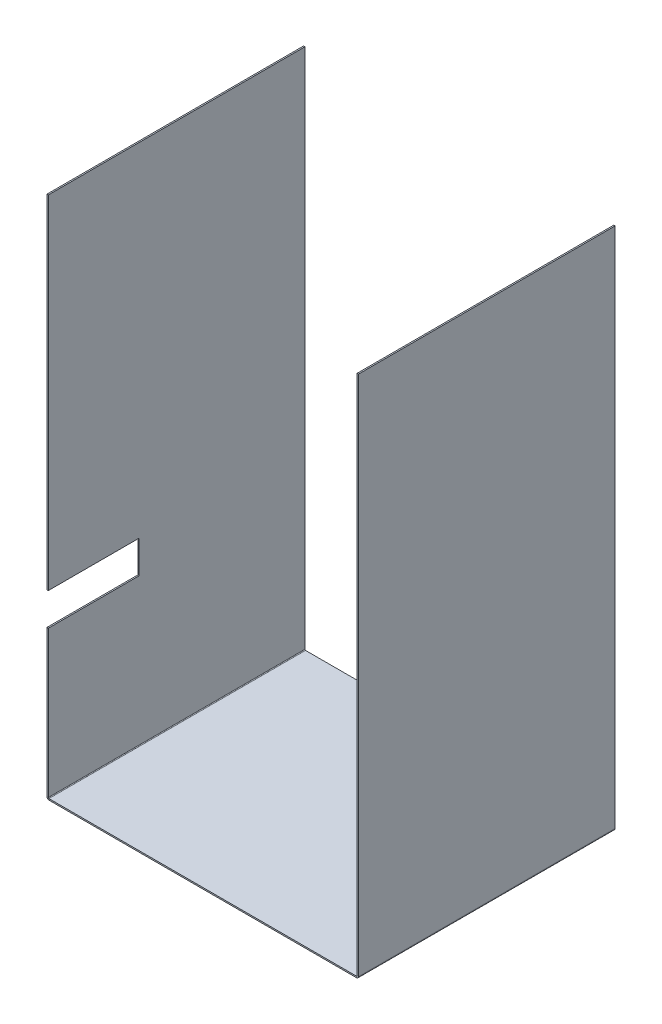
ISO-10303-21;
HEADER;
FILE_DESCRIPTION(('STEP AP214'),'2;1');
FILE_NAME('part.step','',(''),(''),'','','');
FILE_SCHEMA(('AUTOMOTIVE_DESIGN { 1 0 10303 214 1 1 1 1 }'));
ENDSEC;
DATA;
#1=APPLICATION_CONTEXT('core data for automotive mechanical design processes');
#2=APPLICATION_PROTOCOL_DEFINITION('international standard','automotive_design',2000,#1);
#3=PRODUCT_CONTEXT('',#1,'mechanical');
#4=PRODUCT('Part','Part','',(#3));
#5=PRODUCT_RELATED_PRODUCT_CATEGORY('part','',(#4));
#6=PRODUCT_DEFINITION_FORMATION('','',#4);
#7=PRODUCT_DEFINITION_CONTEXT('part definition',#1,'design');
#8=PRODUCT_DEFINITION('design','',#6,#7);
#9=PRODUCT_DEFINITION_SHAPE('','',#8);
#10=(LENGTH_UNIT() NAMED_UNIT(*) SI_UNIT(.MILLI.,.METRE.));
#11=(NAMED_UNIT(*) PLANE_ANGLE_UNIT() SI_UNIT($,.RADIAN.));
#12=(NAMED_UNIT(*) SI_UNIT($,.STERADIAN.) SOLID_ANGLE_UNIT());
#13=UNCERTAINTY_MEASURE_WITH_UNIT(LENGTH_MEASURE(1.E-05),#10,'distance_accuracy_value','');
#14=(GEOMETRIC_REPRESENTATION_CONTEXT(3) GLOBAL_UNCERTAINTY_ASSIGNED_CONTEXT((#13)) GLOBAL_UNIT_ASSIGNED_CONTEXT((#10,
#11,#12)) REPRESENTATION_CONTEXT('',''));
#15=CARTESIAN_POINT('',(0.,0.,0.));
#16=DIRECTION('',(0.,0.,1.));
#17=DIRECTION('',(1.,0.,0.));
#18=AXIS2_PLACEMENT_3D('',#15,#16,#17);
#19=CARTESIAN_POINT('',(112.814408783464,-313.416268033811,280.));
#20=DIRECTION('',(0.,0.,1.));
#21=DIRECTION('',(-1.,0.,0.));
#22=AXIS2_PLACEMENT_3D('',#19,#20,#21);
#23=PLANE('',#22);
#24=DIRECTION('',(-1.,0.,0.));
#25=VECTOR('',#24,1.);
#26=CARTESIAN_POINT('',(112.814408783464,-118.015892073635,280.));
#27=LINE('',#26,#25);
#28=CARTESIAN_POINT('',(-223.448991216536,-118.015892073635,280.));
#29=VERTEX_POINT('',#28);
#30=CARTESIAN_POINT('',(-224.948991216536,-118.015892073635,280.));
#31=VERTEX_POINT('',#30);
#32=EDGE_CURVE('E11',#29,#31,#27,.T.);
#33=ORIENTED_EDGE('',*,*,#32,.F.);
#34=DIRECTION('',(0.,-1.,0.));
#35=VECTOR('',#34,1.);
#36=CARTESIAN_POINT('',(-223.448991216536,255.847131966189,280.));
#37=LINE('',#36,#35);
#38=CARTESIAN_POINT('',(-223.448991216536,255.847131966189,280.));
#39=VERTEX_POINT('',#38);
#40=EDGE_CURVE('E281',#39,#29,#37,.T.);
#41=ORIENTED_EDGE('',*,*,#40,.F.);
#42=DIRECTION('',(1.,0.,0.));
#43=VECTOR('',#42,1.);
#44=CARTESIAN_POINT('',(-224.948991216536,255.847131966189,280.));
#45=LINE('',#44,#43);
#46=CARTESIAN_POINT('',(-224.948991216536,255.847131966189,280.));
#47=VERTEX_POINT('',#46);
#48=EDGE_CURVE('E285',#47,#39,#45,.T.);
#49=ORIENTED_EDGE('',*,*,#48,.F.);
#50=DIRECTION('',(0.,-1.,0.));
#51=VECTOR('',#50,1.);
#52=CARTESIAN_POINT('',(-224.948991216536,255.847131966189,280.));
#53=LINE('',#52,#51);
#54=EDGE_CURVE('E168',#47,#31,#53,.T.);
#55=ORIENTED_EDGE('',*,*,#54,.T.);
#56=EDGE_LOOP('',(#33,#41,#49,#55));
#57=FACE_BOUND('',#56,.T.);
#58=ADVANCED_FACE('F38',(#57),#23,.T.);
#59=CARTESIAN_POINT('',(113.551008783464,-313.416268033811,280.));
#60=DIRECTION('',(0.,0.,1.));
#61=DIRECTION('',(1.,0.,0.));
#62=AXIS2_PLACEMENT_3D('',#59,#60,#61);
#63=PLANE('',#62);
#64=DIRECTION('',(1.,0.,0.));
#65=VECTOR('',#64,1.);
#66=CARTESIAN_POINT('',(113.551008783464,-313.416268033811,280.));
#67=LINE('',#66,#65);
#68=CARTESIAN_POINT('',(113.551008783464,-313.416268033811,280.));
#69=VERTEX_POINT('',#68);
#70=CARTESIAN_POINT('',(115.051008783464,-313.416268033811,280.));
#71=VERTEX_POINT('',#70);
#72=EDGE_CURVE('E63',#69,#71,#67,.T.);
#73=ORIENTED_EDGE('',*,*,#72,.F.);
#74=CARTESIAN_POINT('',(112.814408783464,-313.416268033811,280.));
#75=DIRECTION('',(0.,0.,1.));
#76=DIRECTION('',(1.,0.,0.));
#77=AXIS2_PLACEMENT_3D('',#74,#75,#76);
#78=CIRCLE('',#77,0.7366);
#79=CARTESIAN_POINT('',(112.814408783464,-314.152868033811,280.));
#80=VERTEX_POINT('',#79);
#81=EDGE_CURVE('E325',#80,#69,#78,.T.);
#82=ORIENTED_EDGE('',*,*,#81,.F.);
#83=DIRECTION('',(0.,1.,0.));
#84=VECTOR('',#83,1.);
#85=CARTESIAN_POINT('',(112.814408783464,-315.652868033811,280.));
#86=LINE('',#85,#84);
#87=CARTESIAN_POINT('',(112.814408783464,-315.652868033811,280.));
#88=VERTEX_POINT('',#87);
#89=EDGE_CURVE('E255',#88,#80,#86,.T.);
#90=ORIENTED_EDGE('',*,*,#89,.F.);
#91=CARTESIAN_POINT('',(112.814408783464,-313.416268033811,280.));
#92=DIRECTION('',(0.,0.,1.));
#93=DIRECTION('',(-1.,0.,0.));
#94=AXIS2_PLACEMENT_3D('',#91,#92,#93);
#95=CIRCLE('',#94,2.2366);
#96=EDGE_CURVE('E185',#88,#71,#95,.T.);
#97=ORIENTED_EDGE('',*,*,#96,.T.);
#98=EDGE_LOOP('',(#73,#82,#90,#97));
#99=FACE_BOUND('',#98,.T.);
#100=ADVANCED_FACE('F40',(#99),#63,.T.);
#101=CARTESIAN_POINT('',(112.814408783464,-315.652868033811,280.));
#102=DIRECTION('',(0.,0.,1.));
#103=DIRECTION('',(1.,0.,0.));
#104=AXIS2_PLACEMENT_3D('',#101,#102,#103);
#105=PLANE('',#104);
#106=DIRECTION('',(0.,1.,0.));
#107=VECTOR('',#106,1.);
#108=CARTESIAN_POINT('',(113.551008783464,-314.152868033811,280.));
#109=LINE('',#108,#107);
#110=CARTESIAN_POINT('',(113.551008783464,255.847131966189,280.));
#111=VERTEX_POINT('',#110);
#112=EDGE_CURVE('E326',#69,#111,#109,.T.);
#113=ORIENTED_EDGE('',*,*,#112,.F.);
#114=ORIENTED_EDGE('',*,*,#72,.T.);
#115=DIRECTION('',(0.,1.,0.));
#116=VECTOR('',#115,1.);
#117=CARTESIAN_POINT('',(115.051008783464,-314.152868033811,280.));
#118=LINE('',#117,#116);
#119=CARTESIAN_POINT('',(115.051008783464,255.847131966189,280.));
#120=VERTEX_POINT('',#119);
#121=EDGE_CURVE('E115',#71,#120,#118,.T.);
#122=ORIENTED_EDGE('',*,*,#121,.T.);
#123=DIRECTION('',(1.,0.,0.));
#124=VECTOR('',#123,1.);
#125=CARTESIAN_POINT('',(113.551008783464,255.847131966189,280.));
#126=LINE('',#125,#124);
#127=EDGE_CURVE('E329',#111,#120,#126,.T.);
#128=ORIENTED_EDGE('',*,*,#127,.F.);
#129=EDGE_LOOP('',(#113,#114,#122,#128));
#130=FACE_BOUND('',#129,.T.);
#131=ADVANCED_FACE('F371',(#130),#105,.T.);
#132=CARTESIAN_POINT('',(112.814408783464,-314.152868033811,0.));
#133=DIRECTION('',(0.,0.,-1.));
#134=DIRECTION('',(-1.,0.,0.));
#135=AXIS2_PLACEMENT_3D('',#132,#133,#134);
#136=PLANE('',#135);
#137=DIRECTION('',(0.,-1.,0.));
#138=VECTOR('',#137,1.);
#139=CARTESIAN_POINT('',(112.814408783464,-314.152868033811,0.));
#140=LINE('',#139,#138);
#141=CARTESIAN_POINT('',(112.814408783464,-314.152868033811,0.));
#142=VERTEX_POINT('',#141);
#143=CARTESIAN_POINT('',(112.814408783464,-315.652868033811,0.));
#144=VERTEX_POINT('',#143);
#145=EDGE_CURVE('E253',#142,#144,#140,.T.);
#146=ORIENTED_EDGE('',*,*,#145,.F.);
#147=CARTESIAN_POINT('',(112.814408783464,-313.416268033811,0.));
#148=DIRECTION('',(0.,0.,1.));
#149=DIRECTION('',(1.,0.,0.));
#150=AXIS2_PLACEMENT_3D('',#147,#148,#149);
#151=CIRCLE('',#150,0.7366);
#152=CARTESIAN_POINT('',(113.551008783464,-313.416268033811,0.));
#153=VERTEX_POINT('',#152);
#154=EDGE_CURVE('E201',#142,#153,#151,.T.);
#155=ORIENTED_EDGE('',*,*,#154,.T.);
#156=DIRECTION('',(-1.,0.,0.));
#157=VECTOR('',#156,1.);
#158=CARTESIAN_POINT('',(115.051008783464,-313.416268033811,0.));
#159=LINE('',#158,#157);
#160=CARTESIAN_POINT('',(115.051008783464,-313.416268033811,0.));
#161=VERTEX_POINT('',#160);
#162=EDGE_CURVE('E109',#161,#153,#159,.T.);
#163=ORIENTED_EDGE('',*,*,#162,.F.);
#164=CARTESIAN_POINT('',(112.814408783464,-313.416268033811,0.));
#165=DIRECTION('',(0.,0.,1.));
#166=DIRECTION('',(-1.,0.,0.));
#167=AXIS2_PLACEMENT_3D('',#164,#165,#166);
#168=CIRCLE('',#167,2.2366);
#169=EDGE_CURVE('E221',#144,#161,#168,.T.);
#170=ORIENTED_EDGE('',*,*,#169,.F.);
#171=EDGE_LOOP('',(#146,#155,#163,#170));
#172=FACE_BOUND('',#171,.T.);
#173=ADVANCED_FACE('F320',(#172),#136,.T.);
#174=CARTESIAN_POINT('',(115.051008783464,-313.416268033811,0.));
#175=DIRECTION('',(0.,0.,-1.));
#176=DIRECTION('',(-1.,0.,0.));
#177=AXIS2_PLACEMENT_3D('',#174,#175,#176);
#178=PLANE('',#177);
#179=DIRECTION('',(1.,0.,0.));
#180=VECTOR('',#179,1.);
#181=CARTESIAN_POINT('',(-223.448991216536,-314.152868033811,0.));
#182=LINE('',#181,#180);
#183=CARTESIAN_POINT('',(-222.712391216536,-314.152868033811,0.));
#184=VERTEX_POINT('',#183);
#185=EDGE_CURVE('E203',#184,#142,#182,.T.);
#186=ORIENTED_EDGE('',*,*,#185,.T.);
#187=ORIENTED_EDGE('',*,*,#145,.T.);
#188=DIRECTION('',(1.,0.,0.));
#189=VECTOR('',#188,1.);
#190=CARTESIAN_POINT('',(-223.448991216536,-315.652868033811,0.));
#191=LINE('',#190,#189);
#192=CARTESIAN_POINT('',(-222.712391216536,-315.652868033811,0.));
#193=VERTEX_POINT('',#192);
#194=EDGE_CURVE('E219',#193,#144,#191,.T.);
#195=ORIENTED_EDGE('',*,*,#194,.F.);
#196=DIRECTION('',(0.,1.,0.));
#197=VECTOR('',#196,1.);
#198=CARTESIAN_POINT('',(-222.712391216536,-315.652868033811,0.));
#199=LINE('',#198,#197);
#200=EDGE_CURVE('E247',#193,#184,#199,.T.);
#201=ORIENTED_EDGE('',*,*,#200,.T.);
#202=EDGE_LOOP('',(#186,#187,#195,#201));
#203=FACE_BOUND('',#202,.T.);
#204=ADVANCED_FACE('F306',(#203),#178,.T.);
#205=CARTESIAN_POINT('',(-222.712391216536,-314.152868033811,280.));
#206=DIRECTION('',(0.,0.,1.));
#207=DIRECTION('',(1.,0.,0.));
#208=AXIS2_PLACEMENT_3D('',#205,#206,#207);
#209=PLANE('',#208);
#210=DIRECTION('',(0.,-1.,0.));
#211=VECTOR('',#210,1.);
#212=CARTESIAN_POINT('',(-222.712391216536,-314.152868033811,280.));
#213=LINE('',#212,#211);
#214=CARTESIAN_POINT('',(-222.712391216536,-314.152868033811,280.));
#215=VERTEX_POINT('',#214);
#216=CARTESIAN_POINT('',(-222.712391216536,-315.652868033811,280.));
#217=VERTEX_POINT('',#216);
#218=EDGE_CURVE('E145',#215,#217,#213,.T.);
#219=ORIENTED_EDGE('',*,*,#218,.F.);
#220=CARTESIAN_POINT('',(-222.712391216536,-313.416268033811,280.));
#221=DIRECTION('',(0.,0.,1.));
#222=DIRECTION('',(1.,0.,0.));
#223=AXIS2_PLACEMENT_3D('',#220,#221,#222);
#224=CIRCLE('',#223,0.7366);
#225=CARTESIAN_POINT('',(-223.448991216536,-313.416268033811,280.));
#226=VERTEX_POINT('',#225);
#227=EDGE_CURVE('E282',#226,#215,#224,.T.);
#228=ORIENTED_EDGE('',*,*,#227,.F.);
#229=DIRECTION('',(1.,0.,0.));
#230=VECTOR('',#229,1.);
#231=CARTESIAN_POINT('',(-224.948991216536,-313.416268033811,280.));
#232=LINE('',#231,#230);
#233=CARTESIAN_POINT('',(-224.948991216536,-313.416268033811,280.));
#234=VERTEX_POINT('',#233);
#235=EDGE_CURVE('E157',#234,#226,#232,.T.);
#236=ORIENTED_EDGE('',*,*,#235,.F.);
#237=CARTESIAN_POINT('',(-222.712391216536,-313.416268033811,280.));
#238=DIRECTION('',(0.,0.,1.));
#239=DIRECTION('',(-1.,0.,0.));
#240=AXIS2_PLACEMENT_3D('',#237,#238,#239);
#241=CIRCLE('',#240,2.2366);
#242=EDGE_CURVE('E161',#234,#217,#241,.T.);
#243=ORIENTED_EDGE('',*,*,#242,.T.);
#244=EDGE_LOOP('',(#219,#228,#236,#243));
#245=FACE_BOUND('',#244,.T.);
#246=ADVANCED_FACE('F163',(#245),#209,.T.);
#247=CARTESIAN_POINT('',(-224.948991216536,-313.416268033811,280.));
#248=DIRECTION('',(0.,0.,1.));
#249=DIRECTION('',(1.,0.,0.));
#250=AXIS2_PLACEMENT_3D('',#247,#248,#249);
#251=PLANE('',#250);
#252=DIRECTION('',(1.,0.,0.));
#253=VECTOR('',#252,1.);
#254=CARTESIAN_POINT('',(-223.448991216536,-314.152868033811,280.));
#255=LINE('',#254,#253);
#256=EDGE_CURVE('E152',#215,#80,#255,.T.);
#257=ORIENTED_EDGE('',*,*,#256,.F.);
#258=ORIENTED_EDGE('',*,*,#218,.T.);
#259=DIRECTION('',(1.,0.,0.));
#260=VECTOR('',#259,1.);
#261=CARTESIAN_POINT('',(-223.448991216536,-315.652868033811,280.));
#262=LINE('',#261,#260);
#263=EDGE_CURVE('E149',#217,#88,#262,.T.);
#264=ORIENTED_EDGE('',*,*,#263,.T.);
#265=ORIENTED_EDGE('',*,*,#89,.T.);
#266=EDGE_LOOP('',(#257,#258,#264,#265));
#267=FACE_BOUND('',#266,.T.);
#268=ADVANCED_FACE('F147',(#267),#251,.T.);
#269=CARTESIAN_POINT('',(-223.448991216536,-313.416268033811,0.));
#270=DIRECTION('',(0.,0.,-1.));
#271=DIRECTION('',(-1.,0.,0.));
#272=AXIS2_PLACEMENT_3D('',#269,#270,#271);
#273=PLANE('',#272);
#274=DIRECTION('',(-1.,0.,0.));
#275=VECTOR('',#274,1.);
#276=CARTESIAN_POINT('',(-223.448991216536,-313.416268033811,0.));
#277=LINE('',#276,#275);
#278=CARTESIAN_POINT('',(-223.448991216536,-313.416268033811,0.));
#279=VERTEX_POINT('',#278);
#280=CARTESIAN_POINT('',(-224.948991216536,-313.416268033811,0.));
#281=VERTEX_POINT('',#280);
#282=EDGE_CURVE('E249',#279,#281,#277,.T.);
#283=ORIENTED_EDGE('',*,*,#282,.F.);
#284=CARTESIAN_POINT('',(-222.712391216536,-313.416268033811,0.));
#285=DIRECTION('',(0.,0.,1.));
#286=DIRECTION('',(1.,0.,0.));
#287=AXIS2_PLACEMENT_3D('',#284,#285,#286);
#288=CIRCLE('',#287,0.7366);
#289=EDGE_CURVE('E206',#279,#184,#288,.T.);
#290=ORIENTED_EDGE('',*,*,#289,.T.);
#291=ORIENTED_EDGE('',*,*,#200,.F.);
#292=CARTESIAN_POINT('',(-222.712391216536,-313.416268033811,0.));
#293=DIRECTION('',(0.,0.,1.));
#294=DIRECTION('',(-1.,0.,0.));
#295=AXIS2_PLACEMENT_3D('',#292,#293,#294);
#296=CIRCLE('',#295,2.2366);
#297=EDGE_CURVE('E175',#281,#193,#296,.T.);
#298=ORIENTED_EDGE('',*,*,#297,.F.);
#299=EDGE_LOOP('',(#283,#290,#291,#298));
#300=FACE_BOUND('',#299,.T.);
#301=ADVANCED_FACE('F303',(#300),#273,.T.);
#302=CARTESIAN_POINT('',(-222.712391216536,-315.652868033811,0.));
#303=DIRECTION('',(0.,0.,-1.));
#304=DIRECTION('',(-1.,0.,0.));
#305=AXIS2_PLACEMENT_3D('',#302,#303,#304);
#306=PLANE('',#305);
#307=DIRECTION('',(0.,-1.,0.));
#308=VECTOR('',#307,1.);
#309=CARTESIAN_POINT('',(-223.448991216536,255.847131966189,0.));
#310=LINE('',#309,#308);
#311=CARTESIAN_POINT('',(-223.448991216536,255.847131966189,0.));
#312=VERTEX_POINT('',#311);
#313=EDGE_CURVE('E209',#312,#279,#310,.T.);
#314=ORIENTED_EDGE('',*,*,#313,.T.);
#315=ORIENTED_EDGE('',*,*,#282,.T.);
#316=DIRECTION('',(0.,-1.,0.));
#317=VECTOR('',#316,1.);
#318=CARTESIAN_POINT('',(-224.948991216536,255.847131966189,0.));
#319=LINE('',#318,#317);
#320=CARTESIAN_POINT('',(-224.948991216536,255.847131966189,0.));
#321=VERTEX_POINT('',#320);
#322=EDGE_CURVE('E215',#321,#281,#319,.T.);
#323=ORIENTED_EDGE('',*,*,#322,.F.);
#324=DIRECTION('',(1.,0.,0.));
#325=VECTOR('',#324,1.);
#326=CARTESIAN_POINT('',(-224.948991216536,255.847131966189,0.));
#327=LINE('',#326,#325);
#328=EDGE_CURVE('E212',#321,#312,#327,.T.);
#329=ORIENTED_EDGE('',*,*,#328,.T.);
#330=EDGE_LOOP('',(#314,#315,#323,#329));
#331=FACE_BOUND('',#330,.T.);
#332=ADVANCED_FACE('F416',(#331),#306,.T.);
#333=CARTESIAN_POINT('',(115.051008783464,-314.152868033811,280.));
#334=DIRECTION('',(-1.,0.,0.));
#335=DIRECTION('',(0.,-1.,0.));
#336=AXIS2_PLACEMENT_3D('',#333,#334,#335);
#337=PLANE('',#336);
#338=DIRECTION('',(0.,1.,0.));
#339=VECTOR('',#338,1.);
#340=CARTESIAN_POINT('',(115.051008783464,-314.152868033811,0.));
#341=LINE('',#340,#339);
#342=CARTESIAN_POINT('',(115.051008783464,255.847131966189,0.));
#343=VERTEX_POINT('',#342);
#344=EDGE_CURVE('E191',#161,#343,#341,.T.);
#345=ORIENTED_EDGE('',*,*,#344,.T.);
#346=DIRECTION('',(0.,0.,-1.));
#347=VECTOR('',#346,1.);
#348=CARTESIAN_POINT('',(115.051008783464,255.847131966189,280.));
#349=LINE('',#348,#347);
#350=EDGE_CURVE('E245',#120,#343,#349,.T.);
#351=ORIENTED_EDGE('',*,*,#350,.F.);
#352=ORIENTED_EDGE('',*,*,#121,.F.);
#353=DIRECTION('',(0.,0.,-1.));
#354=VECTOR('',#353,1.);
#355=CARTESIAN_POINT('',(115.051008783464,-313.416268033811,280.));
#356=LINE('',#355,#354);
#357=EDGE_CURVE('E187',#71,#161,#356,.T.);
#358=ORIENTED_EDGE('',*,*,#357,.T.);
#359=EDGE_LOOP('',(#345,#351,#352,#358));
#360=FACE_BOUND('',#359,.T.);
#361=ADVANCED_FACE('F412',(#360),#337,.F.);
#362=CARTESIAN_POINT('',(113.551008783464,255.847131966189,280.));
#363=DIRECTION('',(0.,1.,0.));
#364=DIRECTION('',(0.,0.,1.));
#365=AXIS2_PLACEMENT_3D('',#362,#363,#364);
#366=PLANE('',#365);
#367=DIRECTION('',(1.,0.,0.));
#368=VECTOR('',#367,1.);
#369=CARTESIAN_POINT('',(113.551008783464,255.847131966189,0.));
#370=LINE('',#369,#368);
#371=CARTESIAN_POINT('',(113.551008783464,255.847131966189,0.));
#372=VERTEX_POINT('',#371);
#373=EDGE_CURVE('E194',#372,#343,#370,.T.);
#374=ORIENTED_EDGE('',*,*,#373,.F.);
#375=DIRECTION('',(0.,0.,-1.));
#376=VECTOR('',#375,1.);
#377=CARTESIAN_POINT('',(113.551008783464,255.847131966189,280.));
#378=LINE('',#377,#376);
#379=EDGE_CURVE('E243',#111,#372,#378,.T.);
#380=ORIENTED_EDGE('',*,*,#379,.F.);
#381=ORIENTED_EDGE('',*,*,#127,.T.);
#382=ORIENTED_EDGE('',*,*,#350,.T.);
#383=EDGE_LOOP('',(#374,#380,#381,#382));
#384=FACE_BOUND('',#383,.T.);
#385=ADVANCED_FACE('F408',(#384),#366,.T.);
#386=CARTESIAN_POINT('',(113.551008783464,-314.152868033811,280.));
#387=DIRECTION('',(-1.,0.,0.));
#388=DIRECTION('',(0.,-1.,0.));
#389=AXIS2_PLACEMENT_3D('',#386,#387,#388);
#390=PLANE('',#389);
#391=DIRECTION('',(0.,1.,0.));
#392=VECTOR('',#391,1.);
#393=CARTESIAN_POINT('',(113.551008783464,-314.152868033811,0.));
#394=LINE('',#393,#392);
#395=EDGE_CURVE('E198',#153,#372,#394,.T.);
#396=ORIENTED_EDGE('',*,*,#395,.F.);
#397=DIRECTION('',(0.,0.,-1.));
#398=VECTOR('',#397,1.);
#399=CARTESIAN_POINT('',(113.551008783464,-313.416268033811,280.));
#400=LINE('',#399,#398);
#401=EDGE_CURVE('E240',#69,#153,#400,.T.);
#402=ORIENTED_EDGE('',*,*,#401,.F.);
#403=ORIENTED_EDGE('',*,*,#112,.T.);
#404=ORIENTED_EDGE('',*,*,#379,.T.);
#405=EDGE_LOOP('',(#396,#402,#403,#404));
#406=FACE_BOUND('',#405,.T.);
#407=ADVANCED_FACE('F405',(#406),#390,.T.);
#408=CARTESIAN_POINT('',(112.814408783464,-313.416268033811,280.));
#409=DIRECTION('',(0.,0.,-1.));
#410=DIRECTION('',(-1.,0.,0.));
#411=AXIS2_PLACEMENT_3D('',#408,#409,#410);
#412=CYLINDRICAL_SURFACE('',#411,0.7366);
#413=ORIENTED_EDGE('',*,*,#154,.F.);
#414=DIRECTION('',(0.,0.,-1.));
#415=VECTOR('',#414,1.);
#416=CARTESIAN_POINT('',(112.814408783464,-314.152868033811,280.));
#417=LINE('',#416,#415);
#418=EDGE_CURVE('E237',#80,#142,#417,.T.);
#419=ORIENTED_EDGE('',*,*,#418,.F.);
#420=ORIENTED_EDGE('',*,*,#81,.T.);
#421=ORIENTED_EDGE('',*,*,#401,.T.);
#422=EDGE_LOOP('',(#413,#419,#420,#421));
#423=FACE_BOUND('',#422,.T.);
#424=ADVANCED_FACE('F317',(#423),#412,.F.);
#425=CARTESIAN_POINT('',(-223.448991216536,-314.152868033811,280.));
#426=DIRECTION('',(0.,1.,0.));
#427=DIRECTION('',(-1.,0.,0.));
#428=AXIS2_PLACEMENT_3D('',#425,#426,#427);
#429=PLANE('',#428);
#430=CARTESIAN_POINT('',(33.0542365241619,-314.152868033811,81.517652869995));
#431=DIRECTION('',(0.,1.,0.));
#432=DIRECTION('',(-1.,0.,0.));
#433=AXIS2_PLACEMENT_3D('',#430,#431,#432);
#434=CIRCLE('',#433,38.);
#435=CARTESIAN_POINT('',(-4.9457634758381,-314.152868033811,81.517652869995));
#436=VERTEX_POINT('',#435);
#437=EDGE_CURVE('E349',#436,#436,#434,.T.);
#438=ORIENTED_EDGE('',*,*,#437,.F.);
#439=EDGE_LOOP('',(#438));
#440=FACE_BOUND('',#439,.T.);
#441=ORIENTED_EDGE('',*,*,#185,.F.);
#442=DIRECTION('',(0.,0.,-1.));
#443=VECTOR('',#442,1.);
#444=CARTESIAN_POINT('',(-222.712391216536,-314.152868033811,280.));
#445=LINE('',#444,#443);
#446=EDGE_CURVE('E234',#215,#184,#445,.T.);
#447=ORIENTED_EDGE('',*,*,#446,.F.);
#448=ORIENTED_EDGE('',*,*,#256,.T.);
#449=ORIENTED_EDGE('',*,*,#418,.T.);
#450=EDGE_LOOP('',(#441,#447,#448,#449));
#451=FACE_BOUND('',#450,.T.);
#452=ADVANCED_FACE('F311',(#440,#451),#429,.T.);
#453=CARTESIAN_POINT('',(-222.712391216536,-313.416268033811,280.));
#454=DIRECTION('',(0.,0.,-1.));
#455=DIRECTION('',(-1.,0.,0.));
#456=AXIS2_PLACEMENT_3D('',#453,#454,#455);
#457=CYLINDRICAL_SURFACE('',#456,0.7366);
#458=ORIENTED_EDGE('',*,*,#289,.F.);
#459=DIRECTION('',(0.,0.,-1.));
#460=VECTOR('',#459,1.);
#461=CARTESIAN_POINT('',(-223.448991216536,-313.416268033811,280.));
#462=LINE('',#461,#460);
#463=EDGE_CURVE('E231',#226,#279,#462,.T.);
#464=ORIENTED_EDGE('',*,*,#463,.F.);
#465=ORIENTED_EDGE('',*,*,#227,.T.);
#466=ORIENTED_EDGE('',*,*,#446,.T.);
#467=EDGE_LOOP('',(#458,#464,#465,#466));
#468=FACE_BOUND('',#467,.T.);
#469=ADVANCED_FACE('F309',(#468),#457,.F.);
#470=CARTESIAN_POINT('',(-223.448991216536,255.847131966189,280.));
#471=DIRECTION('',(1.,0.,0.));
#472=DIRECTION('',(0.,0.,-1.));
#473=AXIS2_PLACEMENT_3D('',#470,#471,#472);
#474=PLANE('',#473);
#475=DIRECTION('',(0.,0.,1.));
#476=VECTOR('',#475,1.);
#477=CARTESIAN_POINT('',(-223.448991216536,-118.015892073635,280.));
#478=LINE('',#477,#476);
#479=CARTESIAN_POINT('',(-223.448991216536,-118.015892073635,180.817641303629));
#480=VERTEX_POINT('',#479);
#481=EDGE_CURVE('E276',#480,#29,#478,.T.);
#482=ORIENTED_EDGE('',*,*,#481,.F.);
#483=DIRECTION('',(0.,1.,0.));
#484=VECTOR('',#483,1.);
#485=CARTESIAN_POINT('',(-223.448991216536,255.847131966189,180.817641303629));
#486=LINE('',#485,#484);
#487=CARTESIAN_POINT('',(-223.448991216536,-153.543309691135,180.817641303629));
#488=VERTEX_POINT('',#487);
#489=EDGE_CURVE('E195',#488,#480,#486,.T.);
#490=ORIENTED_EDGE('',*,*,#489,.F.);
#491=DIRECTION('',(0.,0.,-1.));
#492=VECTOR('',#491,1.);
#493=CARTESIAN_POINT('',(-223.448991216536,-153.543309691135,280.));
#494=LINE('',#493,#492);
#495=CARTESIAN_POINT('',(-223.448991216536,-153.543309691135,280.));
#496=VERTEX_POINT('',#495);
#497=EDGE_CURVE('E263',#496,#488,#494,.T.);
#498=ORIENTED_EDGE('',*,*,#497,.F.);
#499=EDGE_CURVE('E274',#496,#226,#37,.T.);
#500=ORIENTED_EDGE('',*,*,#499,.T.);
#501=ORIENTED_EDGE('',*,*,#463,.T.);
#502=ORIENTED_EDGE('',*,*,#313,.F.);
#503=DIRECTION('',(0.,0.,-1.));
#504=VECTOR('',#503,1.);
#505=CARTESIAN_POINT('',(-223.448991216536,255.847131966189,280.));
#506=LINE('',#505,#504);
#507=EDGE_CURVE('E229',#39,#312,#506,.T.);
#508=ORIENTED_EDGE('',*,*,#507,.F.);
#509=ORIENTED_EDGE('',*,*,#40,.T.);
#510=EDGE_LOOP('',(#482,#490,#498,#500,#501,#502,#508,#509));
#511=FACE_BOUND('',#510,.T.);
#512=ADVANCED_FACE('F273',(#511),#474,.T.);
#513=CARTESIAN_POINT('',(-224.948991216536,255.847131966189,280.));
#514=DIRECTION('',(0.,1.,0.));
#515=DIRECTION('',(0.,0.,1.));
#516=AXIS2_PLACEMENT_3D('',#513,#514,#515);
#517=PLANE('',#516);
#518=ORIENTED_EDGE('',*,*,#328,.F.);
#519=DIRECTION('',(0.,0.,-1.));
#520=VECTOR('',#519,1.);
#521=CARTESIAN_POINT('',(-224.948991216536,255.847131966189,280.));
#522=LINE('',#521,#520);
#523=EDGE_CURVE('E227',#47,#321,#522,.T.);
#524=ORIENTED_EDGE('',*,*,#523,.F.);
#525=ORIENTED_EDGE('',*,*,#48,.T.);
#526=ORIENTED_EDGE('',*,*,#507,.T.);
#527=EDGE_LOOP('',(#518,#524,#525,#526));
#528=FACE_BOUND('',#527,.T.);
#529=ADVANCED_FACE('F392',(#528),#517,.T.);
#530=CARTESIAN_POINT('',(-224.948991216536,255.847131966189,280.));
#531=DIRECTION('',(1.,0.,0.));
#532=DIRECTION('',(0.,0.,-1.));
#533=AXIS2_PLACEMENT_3D('',#530,#531,#532);
#534=PLANE('',#533);
#535=DIRECTION('',(0.,-1.,0.));
#536=VECTOR('',#535,1.);
#537=CARTESIAN_POINT('',(-224.948991216536,-118.015892073635,180.817641303629));
#538=LINE('',#537,#536);
#539=CARTESIAN_POINT('',(-224.948991216536,-118.015892073635,180.817641303629));
#540=VERTEX_POINT('',#539);
#541=CARTESIAN_POINT('',(-224.948991216536,-153.543309691135,180.817641303629));
#542=VERTEX_POINT('',#541);
#543=EDGE_CURVE('E346',#540,#542,#538,.T.);
#544=ORIENTED_EDGE('',*,*,#543,.F.);
#545=DIRECTION('',(0.,0.,-1.));
#546=VECTOR('',#545,1.);
#547=CARTESIAN_POINT('',(-224.948991216536,-118.015892073635,286.540518916469));
#548=LINE('',#547,#546);
#549=EDGE_CURVE('E340',#31,#540,#548,.T.);
#550=ORIENTED_EDGE('',*,*,#549,.F.);
#551=ORIENTED_EDGE('',*,*,#54,.F.);
#552=ORIENTED_EDGE('',*,*,#523,.T.);
#553=ORIENTED_EDGE('',*,*,#322,.T.);
#554=DIRECTION('',(0.,0.,-1.));
#555=VECTOR('',#554,1.);
#556=CARTESIAN_POINT('',(-224.948991216536,-313.416268033811,280.));
#557=LINE('',#556,#555);
#558=EDGE_CURVE('E179',#234,#281,#557,.T.);
#559=ORIENTED_EDGE('',*,*,#558,.F.);
#560=CARTESIAN_POINT('',(-224.948991216536,-153.543309691135,280.));
#561=VERTEX_POINT('',#560);
#562=EDGE_CURVE('E290',#561,#234,#53,.T.);
#563=ORIENTED_EDGE('',*,*,#562,.F.);
#564=DIRECTION('',(0.,0.,1.));
#565=VECTOR('',#564,1.);
#566=CARTESIAN_POINT('',(-224.948991216536,-153.543309691135,286.540518916469));
#567=LINE('',#566,#565);
#568=EDGE_CURVE('E54',#542,#561,#567,.T.);
#569=ORIENTED_EDGE('',*,*,#568,.F.);
#570=EDGE_LOOP('',(#544,#550,#551,#552,#553,#559,#563,#569));
#571=FACE_BOUND('',#570,.T.);
#572=ADVANCED_FACE('F299',(#571),#534,.F.);
#573=CARTESIAN_POINT('',(-222.712391216536,-313.416268033811,280.));
#574=DIRECTION('',(0.,0.,-1.));
#575=DIRECTION('',(-1.,0.,0.));
#576=AXIS2_PLACEMENT_3D('',#573,#574,#575);
#577=CYLINDRICAL_SURFACE('',#576,2.2366);
#578=ORIENTED_EDGE('',*,*,#297,.T.);
#579=DIRECTION('',(0.,0.,-1.));
#580=VECTOR('',#579,1.);
#581=CARTESIAN_POINT('',(-222.712391216536,-315.652868033811,280.));
#582=LINE('',#581,#580);
#583=EDGE_CURVE('E172',#217,#193,#582,.T.);
#584=ORIENTED_EDGE('',*,*,#583,.F.);
#585=ORIENTED_EDGE('',*,*,#242,.F.);
#586=ORIENTED_EDGE('',*,*,#558,.T.);
#587=EDGE_LOOP('',(#578,#584,#585,#586));
#588=FACE_BOUND('',#587,.T.);
#589=ADVANCED_FACE('F173',(#588),#577,.T.);
#590=CARTESIAN_POINT('',(-223.448991216536,-315.652868033811,280.));
#591=DIRECTION('',(0.,1.,0.));
#592=DIRECTION('',(-1.,0.,0.));
#593=AXIS2_PLACEMENT_3D('',#590,#591,#592);
#594=PLANE('',#593);
#595=CARTESIAN_POINT('',(33.0542365241619,-315.652868033811,81.517652869995));
#596=DIRECTION('',(0.,1.,0.));
#597=DIRECTION('',(-1.,0.,0.));
#598=AXIS2_PLACEMENT_3D('',#595,#596,#597);
#599=CIRCLE('',#598,38.);
#600=CARTESIAN_POINT('',(-4.9457634758381,-315.652868033811,81.517652869995));
#601=VERTEX_POINT('',#600);
#602=EDGE_CURVE('E42',#601,#601,#599,.T.);
#603=ORIENTED_EDGE('',*,*,#602,.T.);
#604=EDGE_LOOP('',(#603));
#605=FACE_BOUND('',#604,.T.);
#606=ORIENTED_EDGE('',*,*,#194,.T.);
#607=DIRECTION('',(0.,0.,-1.));
#608=VECTOR('',#607,1.);
#609=CARTESIAN_POINT('',(112.814408783464,-315.652868033811,280.));
#610=LINE('',#609,#608);
#611=EDGE_CURVE('E180',#88,#144,#610,.T.);
#612=ORIENTED_EDGE('',*,*,#611,.F.);
#613=ORIENTED_EDGE('',*,*,#263,.F.);
#614=ORIENTED_EDGE('',*,*,#583,.T.);
#615=EDGE_LOOP('',(#606,#612,#613,#614));
#616=FACE_BOUND('',#615,.T.);
#617=ADVANCED_FACE('F182',(#605,#616),#594,.F.);
#618=CARTESIAN_POINT('',(112.814408783464,-313.416268033811,280.));
#619=DIRECTION('',(0.,0.,-1.));
#620=DIRECTION('',(-1.,0.,0.));
#621=AXIS2_PLACEMENT_3D('',#618,#619,#620);
#622=CYLINDRICAL_SURFACE('',#621,2.2366);
#623=ORIENTED_EDGE('',*,*,#169,.T.);
#624=ORIENTED_EDGE('',*,*,#357,.F.);
#625=ORIENTED_EDGE('',*,*,#96,.F.);
#626=ORIENTED_EDGE('',*,*,#611,.T.);
#627=EDGE_LOOP('',(#623,#624,#625,#626));
#628=FACE_BOUND('',#627,.T.);
#629=ADVANCED_FACE('F322',(#628),#622,.T.);
#630=DIRECTION('',(1.,0.,0.));
#631=VECTOR('',#630,1.);
#632=CARTESIAN_POINT('',(112.814408783464,-153.543309691135,280.));
#633=LINE('',#632,#631);
#634=EDGE_CURVE('E47',#561,#496,#633,.T.);
#635=ORIENTED_EDGE('',*,*,#634,.F.);
#636=ORIENTED_EDGE('',*,*,#562,.T.);
#637=ORIENTED_EDGE('',*,*,#235,.T.);
#638=ORIENTED_EDGE('',*,*,#499,.F.);
#639=EDGE_LOOP('',(#635,#636,#637,#638));
#640=FACE_BOUND('',#639,.T.);
#641=ADVANCED_FACE('F279',(#640),#23,.T.);
#642=CARTESIAN_POINT('',(112.814408783464,-313.416268033811,0.));
#643=DIRECTION('',(0.,0.,1.));
#644=DIRECTION('',(-1.,0.,0.));
#645=AXIS2_PLACEMENT_3D('',#642,#643,#644);
#646=PLANE('',#645);
#647=ORIENTED_EDGE('',*,*,#344,.F.);
#648=ORIENTED_EDGE('',*,*,#162,.T.);
#649=ORIENTED_EDGE('',*,*,#395,.T.);
#650=ORIENTED_EDGE('',*,*,#373,.T.);
#651=EDGE_LOOP('',(#647,#648,#649,#650));
#652=FACE_BOUND('',#651,.T.);
#653=ADVANCED_FACE('F375',(#652),#646,.F.);
#654=CARTESIAN_POINT('',(-214.948991216536,-118.015892073635,180.817641303629));
#655=DIRECTION('',(0.,0.,-1.));
#656=DIRECTION('',(-1.,0.,0.));
#657=AXIS2_PLACEMENT_3D('',#654,#655,#656);
#658=PLANE('',#657);
#659=ORIENTED_EDGE('',*,*,#489,.T.);
#660=DIRECTION('',(-1.,0.,0.));
#661=VECTOR('',#660,1.);
#662=CARTESIAN_POINT('',(-214.948991216536,-118.015892073635,180.817641303629));
#663=LINE('',#662,#661);
#664=EDGE_CURVE('E277',#480,#540,#663,.T.);
#665=ORIENTED_EDGE('',*,*,#664,.T.);
#666=ORIENTED_EDGE('',*,*,#543,.T.);
#667=DIRECTION('',(-1.,0.,0.));
#668=VECTOR('',#667,1.);
#669=CARTESIAN_POINT('',(-214.948991216536,-153.543309691135,180.817641303629));
#670=LINE('',#669,#668);
#671=EDGE_CURVE('E338',#488,#542,#670,.T.);
#672=ORIENTED_EDGE('',*,*,#671,.F.);
#673=EDGE_LOOP('',(#659,#665,#666,#672));
#674=FACE_BOUND('',#673,.T.);
#675=ADVANCED_FACE('F380',(#674),#658,.F.);
#676=CARTESIAN_POINT('',(-214.948991216536,-118.015892073635,286.540518916469));
#677=DIRECTION('',(0.,1.,0.));
#678=DIRECTION('',(0.,0.,1.));
#679=AXIS2_PLACEMENT_3D('',#676,#677,#678);
#680=PLANE('',#679);
#681=ORIENTED_EDGE('',*,*,#481,.T.);
#682=ORIENTED_EDGE('',*,*,#32,.T.);
#683=ORIENTED_EDGE('',*,*,#549,.T.);
#684=ORIENTED_EDGE('',*,*,#664,.F.);
#685=EDGE_LOOP('',(#681,#682,#683,#684));
#686=FACE_BOUND('',#685,.T.);
#687=ADVANCED_FACE('F363',(#686),#680,.F.);
#688=CARTESIAN_POINT('',(-214.948991216536,-153.543309691135,286.540518916469));
#689=DIRECTION('',(0.,-1.,0.));
#690=DIRECTION('',(1.,0.,0.));
#691=AXIS2_PLACEMENT_3D('',#688,#689,#690);
#692=PLANE('',#691);
#693=ORIENTED_EDGE('',*,*,#497,.T.);
#694=ORIENTED_EDGE('',*,*,#671,.T.);
#695=ORIENTED_EDGE('',*,*,#568,.T.);
#696=ORIENTED_EDGE('',*,*,#634,.T.);
#697=EDGE_LOOP('',(#693,#694,#695,#696));
#698=FACE_BOUND('',#697,.T.);
#699=ADVANCED_FACE('F261',(#698),#692,.F.);
#700=CARTESIAN_POINT('',(33.054236524162,-814.152868033811,81.517652869995));
#701=DIRECTION('',(0.,1.,0.));
#702=DIRECTION('',(-1.,0.,0.));
#703=AXIS2_PLACEMENT_3D('',#700,#701,#702);
#704=CYLINDRICAL_SURFACE('',#703,38.);
#705=ORIENTED_EDGE('',*,*,#437,.T.);
#706=EDGE_LOOP('',(#705));
#707=FACE_BOUND('',#706,.T.);
#708=ORIENTED_EDGE('',*,*,#602,.F.);
#709=EDGE_LOOP('',(#708));
#710=FACE_BOUND('',#709,.T.);
#711=ADVANCED_FACE('F357',(#707,#710),#704,.F.);
#712=CLOSED_SHELL('',(#58,#100,#131,#173,#204,#246,#268,#301,#332,#361,#385,#407,#424,#452,#469,
#512,#529,#572,#589,#617,#629,#641,#653,#675,#687,#699,#711));
#713=MANIFOLD_SOLID_BREP('B2',#712);
#714=ADVANCED_BREP_SHAPE_REPRESENTATION('',(#18,#713),#14);
#715=SHAPE_DEFINITION_REPRESENTATION(#9,#714);
ENDSEC;
END-ISO-10303-21;
